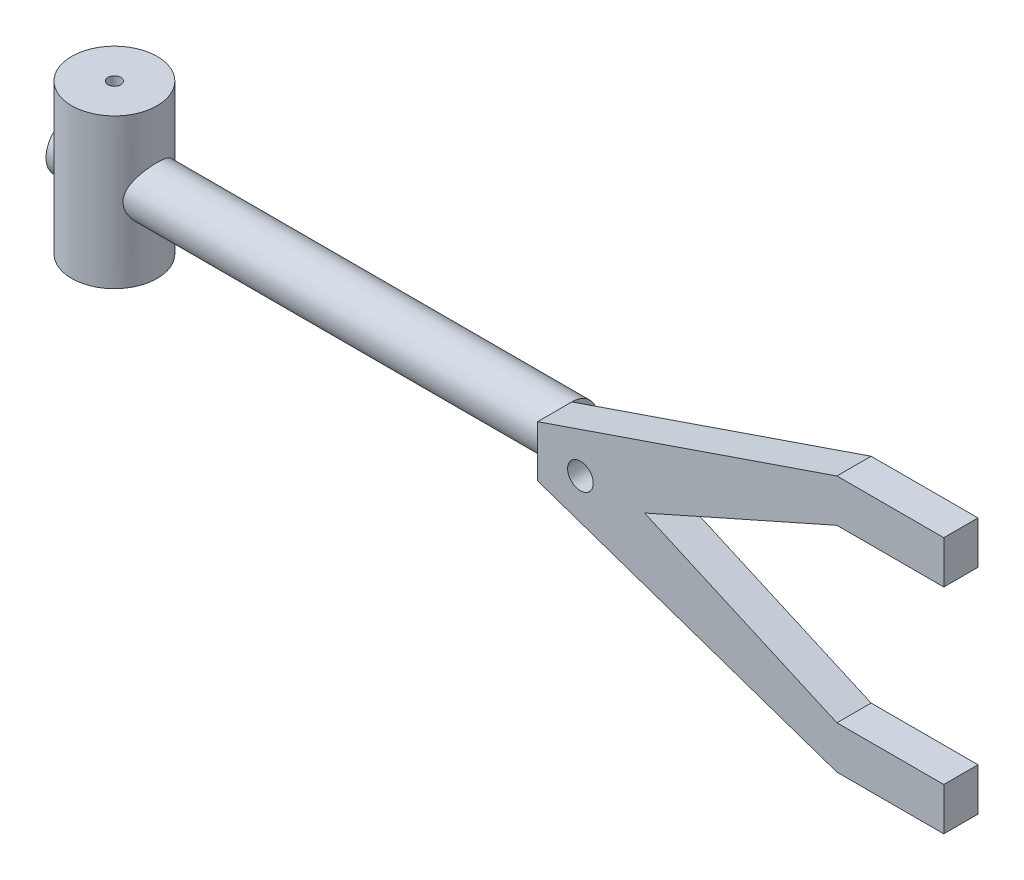
ISO-10303-21;
HEADER;
FILE_DESCRIPTION(('STEP AP214'),'2;1');
FILE_NAME('part.step','',(''),(''),'','','');
FILE_SCHEMA(('AUTOMOTIVE_DESIGN { 1 0 10303 214 1 1 1 1 }'));
ENDSEC;
DATA;
#1=APPLICATION_CONTEXT('core data for automotive mechanical design processes');
#2=APPLICATION_PROTOCOL_DEFINITION('international standard','automotive_design',2000,#1);
#3=PRODUCT_CONTEXT('',#1,'mechanical');
#4=PRODUCT('Part','Part','',(#3));
#5=PRODUCT_RELATED_PRODUCT_CATEGORY('part','',(#4));
#6=PRODUCT_DEFINITION_FORMATION('','',#4);
#7=PRODUCT_DEFINITION_CONTEXT('part definition',#1,'design');
#8=PRODUCT_DEFINITION('design','',#6,#7);
#9=PRODUCT_DEFINITION_SHAPE('','',#8);
#10=(LENGTH_UNIT() NAMED_UNIT(*) SI_UNIT(.MILLI.,.METRE.));
#11=(NAMED_UNIT(*) PLANE_ANGLE_UNIT() SI_UNIT($,.RADIAN.));
#12=(NAMED_UNIT(*) SI_UNIT($,.STERADIAN.) SOLID_ANGLE_UNIT());
#13=UNCERTAINTY_MEASURE_WITH_UNIT(LENGTH_MEASURE(1.E-05),#10,'distance_accuracy_value','');
#14=(GEOMETRIC_REPRESENTATION_CONTEXT(3) GLOBAL_UNCERTAINTY_ASSIGNED_CONTEXT((#13)) GLOBAL_UNIT_ASSIGNED_CONTEXT((#10,
#11,#12)) REPRESENTATION_CONTEXT('',''));
#15=CARTESIAN_POINT('',(0.,0.,0.));
#16=DIRECTION('',(0.,0.,1.));
#17=DIRECTION('',(1.,0.,0.));
#18=AXIS2_PLACEMENT_3D('',#15,#16,#17);
#19=CARTESIAN_POINT('',(-117.,0.,0.));
#20=DIRECTION('',(1.,0.,0.));
#21=DIRECTION('',(0.,1.,0.));
#22=AXIS2_PLACEMENT_3D('',#19,#20,#21);
#23=CYLINDRICAL_SURFACE('',#22,6.);
#24=CARTESIAN_POINT('',(0.,0.,0.));
#25=DIRECTION('',(-1.,0.,0.));
#26=DIRECTION('',(0.,-1.,0.));
#27=AXIS2_PLACEMENT_3D('',#24,#25,#26);
#28=CIRCLE('',#27,6.);
#29=CARTESIAN_POINT('',(0.,-6.,0.));
#30=VERTEX_POINT('',#29);
#31=CARTESIAN_POINT('',(0.,6.,0.));
#32=VERTEX_POINT('',#31);
#33=EDGE_CURVE('E135',#30,#32,#28,.T.);
#34=ORIENTED_EDGE('',*,*,#33,.T.);
#35=EDGE_CURVE('E139',#32,#30,#28,.T.);
#36=ORIENTED_EDGE('',*,*,#35,.T.);
#37=EDGE_LOOP('',(#34,#36));
#38=FACE_BOUND('',#37,.T.);
#39=CARTESIAN_POINT('',(-97.,5.99999999999997,0.));
#40=CARTESIAN_POINT('',(-97.0000011683136,5.99999874519135,-0.153537444551437));
#41=CARTESIAN_POINT('',(-97.0035450390884,5.99409735739944,-0.307113729394928));
#42=CARTESIAN_POINT('',(-97.0176363553633,5.97056698684113,-0.613107521326878));
#43=CARTESIAN_POINT('',(-97.0281878986906,5.95293114218783,-0.76552429760002));
#44=CARTESIAN_POINT('',(-97.0560575008105,5.9061278956508,-1.06824745150987));
#45=CARTESIAN_POINT('',(-97.073388369501,5.87693866177408,-1.21854927251922));
#46=CARTESIAN_POINT('',(-97.1143989472282,5.80740006174153,-1.51572002727397));
#47=CARTESIAN_POINT('',(-97.138081367105,5.76704593017766,-1.66258746605991));
#48=CARTESIAN_POINT('',(-97.1910951803309,5.67591239910302,-1.95109561530948));
#49=CARTESIAN_POINT('',(-97.2203951683515,5.62519085956998,-2.09276039690219));
#50=CARTESIAN_POINT('',(-97.2840807148366,5.51372563088854,-2.37093083799643));
#51=CARTESIAN_POINT('',(-97.3184682376487,5.45297806954219,-2.50743447905545));
#52=CARTESIAN_POINT('',(-97.4281583769666,5.25661592148056,-2.90796291658618));
#53=CARTESIAN_POINT('',(-97.5100583217743,5.10676514066606,-3.1633697760085));
#54=CARTESIAN_POINT('',(-97.6917892990678,4.76089185691862,-3.66523770071096));
#55=CARTESIAN_POINT('',(-97.7925126013811,4.56221486751307,-3.90952112480153));
#56=CARTESIAN_POINT('',(-97.9987981625524,4.13010149782201,-4.36354579042122));
#57=CARTESIAN_POINT('',(-98.1043665015548,3.89662056737338,-4.57324202374219));
#58=CARTESIAN_POINT('',(-98.2655883304351,3.50800100217921,-4.87082578782842));
#59=CARTESIAN_POINT('',(-98.3228427552741,3.36336738175484,-4.97182330842636));
#60=CARTESIAN_POINT('',(-98.4341468221747,3.06480564262361,-5.16122122731059));
#61=CARTESIAN_POINT('',(-98.488195934075,2.91087599479732,-5.24961954505303));
#62=CARTESIAN_POINT('',(-98.5910915626484,2.59462231758671,-5.41290775237596));
#63=CARTESIAN_POINT('',(-98.639944838392,2.43230961233164,-5.48781528185459));
#64=CARTESIAN_POINT('',(-98.7305241067627,2.09994182918051,-5.62338163354011));
#65=CARTESIAN_POINT('',(-98.7722527575794,1.92988966899142,-5.68404577312336));
#66=CARTESIAN_POINT('',(-98.8376238844527,1.62507992086196,-5.77737221892759));
#67=CARTESIAN_POINT('',(-98.8632004570427,1.49171665113409,-5.8132588951073));
#68=CARTESIAN_POINT('',(-98.9083197887664,1.22187048218109,-5.87590039350671));
#69=CARTESIAN_POINT('',(-98.9278638845503,1.08538828124402,-5.90265723881365));
#70=CARTESIAN_POINT('',(-98.9602321012194,0.81025171402131,-5.94666970539668));
#71=CARTESIAN_POINT('',(-98.9730631270236,0.671599731358194,-5.9639350903157));
#72=CARTESIAN_POINT('',(-98.9915617460997,0.392944984699005,-5.9887526638035));
#73=CARTESIAN_POINT('',(-98.9972292160661,0.252942197493465,-5.99630468517717));
#74=CARTESIAN_POINT('',(-99.001184446989,-0.0276304857360648,-6.00157990771218));
#75=CARTESIAN_POINT('',(-98.9994576575907,-0.168200955607132,-5.99928372966397));
#76=CARTESIAN_POINT('',(-98.9886599264627,-0.448547368446017,-5.98485668610316));
#77=CARTESIAN_POINT('',(-98.9795889490494,-0.588323307550082,-5.972725772806));
#78=CARTESIAN_POINT('',(-98.9544403480279,-0.866123194408846,-5.93880584038253));
#79=CARTESIAN_POINT('',(-98.93835956522,-1.00414632330384,-5.91701246647432));
#80=CARTESIAN_POINT('',(-98.8997752813171,-1.277494591076,-5.86407894147696));
#81=CARTESIAN_POINT('',(-98.8772691555594,-1.41281860318444,-5.83293497053063));
#82=CARTESIAN_POINT('',(-98.8018787291031,-1.80996078155561,-5.72698063801509));
#83=CARTESIAN_POINT('',(-98.7407311186157,-2.06687063708726,-5.63915194131273));
#84=CARTESIAN_POINT('',(-98.6029183642115,-2.56281755668071,-5.43180047493027));
#85=CARTESIAN_POINT('',(-98.5262475341567,-2.80184802747996,-5.31226608650175));
#86=CARTESIAN_POINT('',(-98.3497776526446,-3.2999480266043,-5.02070076963738));
#87=CARTESIAN_POINT('',(-98.2482785792978,-3.55521488046637,-4.84314550121071));
#88=CARTESIAN_POINT('',(-98.0941758927166,-3.91476917601741,-4.54957124280611));
#89=CARTESIAN_POINT('',(-98.0424586395197,-4.0308102231317,-4.4470831857426));
#90=CARTESIAN_POINT('',(-97.9394658432492,-4.25478241381091,-4.23329437801548));
#91=CARTESIAN_POINT('',(-97.8881903804441,-4.36271211003625,-4.12199206183185));
#92=CARTESIAN_POINT('',(-97.7801067342962,-4.58443780338888,-3.87481857478411));
#93=CARTESIAN_POINT('',(-97.7235271763483,-4.69694460984084,-3.7376879526544));
#94=CARTESIAN_POINT('',(-97.6138905885834,-4.90992666459092,-3.45314122942452));
#95=CARTESIAN_POINT('',(-97.5608321951904,-5.01040658257615,-3.30572915572594));
#96=CARTESIAN_POINT('',(-97.4596689786642,-5.19848051003326,-3.00130059968158));
#97=CARTESIAN_POINT('',(-97.4115635688938,-5.28607604607442,-2.84428525827771));
#98=CARTESIAN_POINT('',(-97.3216845540227,-5.44741024183805,-2.52155783578279));
#99=CARTESIAN_POINT('',(-97.2799101631641,-5.52115062143015,-2.35584683737313));
#100=CARTESIAN_POINT('',(-97.206357447329,-5.64960422047404,-2.02757278212962));
#101=CARTESIAN_POINT('',(-97.1741153321261,-5.70522314760601,-1.86546851518056));
#102=CARTESIAN_POINT('',(-97.1172304452828,-5.80264595425242,-1.53584722067874));
#103=CARTESIAN_POINT('',(-97.0925874555366,-5.84445023026967,-1.36833034862802));
#104=CARTESIAN_POINT('',(-97.0516718151964,-5.91354449278886,-1.02949369065072));
#105=CARTESIAN_POINT('',(-97.0353908224869,-5.94084894556617,-0.858177873374275));
#106=CARTESIAN_POINT('',(-97.0116833123421,-5.98052893537019,-0.513226306032261));
#107=CARTESIAN_POINT('',(-97.0042555495444,-5.99290657211869,-0.339590885735216));
#108=CARTESIAN_POINT('',(-96.9988818338468,-6.00186382006812,-0.0154285942463958));
#109=CARTESIAN_POINT('',(-96.9997839979444,-6.00036259405744,0.135030316693108));
#110=CARTESIAN_POINT('',(-97.0083472409846,-5.98608043795893,0.435218261170671));
#111=CARTESIAN_POINT('',(-97.0160080972785,-5.97329987944129,0.584947318588602));
#112=CARTESIAN_POINT('',(-97.0379022471421,-5.93663263696758,0.88253605659132));
#113=CARTESIAN_POINT('',(-97.0521350918824,-5.91274671144409,1.03039586412688));
#114=CARTESIAN_POINT('',(-97.086834527003,-5.85417845188862,1.32321247217728));
#115=CARTESIAN_POINT('',(-97.1073012721608,-5.81949584979237,1.46816920051817));
#116=CARTESIAN_POINT('',(-97.153428955466,-5.74072783903301,1.75071908629024));
#117=CARTESIAN_POINT('',(-97.178949657857,-5.69689485862833,1.88840566825774));
#118=CARTESIAN_POINT('',(-97.2349494570828,-5.59980146702507,2.15939029274508));
#119=CARTESIAN_POINT('',(-97.2654301513,-5.54653801822356,2.29268690477591));
#120=CARTESIAN_POINT('',(-97.3634228979728,-5.37333675601086,2.68492536011213));
#121=CARTESIAN_POINT('',(-97.4375207487401,-5.23992952034895,2.93642286384021));
#122=CARTESIAN_POINT('',(-97.6061830068106,-4.92576488033057,3.440061294319));
#123=CARTESIAN_POINT('',(-97.7020732675506,-4.74153073717371,3.68956141515482));
#124=CARTESIAN_POINT('',(-97.9010440169879,-4.33840834205047,4.15611932969621));
#125=CARTESIAN_POINT('',(-98.0041327937384,-4.11947976380931,4.37313879233221));
#126=CARTESIAN_POINT('',(-98.1643281994888,-3.75276518008997,4.68476192706764));
#127=CARTESIAN_POINT('',(-98.221955475257,-3.61538958394491,4.79158950335554));
#128=CARTESIAN_POINT('',(-98.3351255836076,-3.33122262547136,4.99332637800024));
#129=CARTESIAN_POINT('',(-98.3906678747061,-3.18442884363043,5.08823259511329));
#130=CARTESIAN_POINT('',(-98.4978325756379,-2.88215313060631,5.26534568264164));
#131=CARTESIAN_POINT('',(-98.5494575940475,-2.72667710298917,5.34756104251849));
#132=CARTESIAN_POINT('',(-98.6469196114085,-2.40769131587308,5.49855628026276));
#133=CARTESIAN_POINT('',(-98.6927606976014,-2.24418734414733,5.56734566466805));
#134=CARTESIAN_POINT('',(-98.7676877505449,-1.94603699766186,5.67736385859908));
#135=CARTESIAN_POINT('',(-98.7982551666278,-1.81277061398683,5.72133709184489));
#136=CARTESIAN_POINT('',(-98.8537333248931,-1.5424462632691,5.80005690886224));
#137=CARTESIAN_POINT('',(-98.8786470385338,-1.40539033062027,5.83480834103845));
#138=CARTESIAN_POINT('',(-98.9219812013756,-1.12831159570843,5.8946568885387));
#139=CARTESIAN_POINT('',(-98.9404080458909,-0.988291860653551,5.91976351478429));
#140=CARTESIAN_POINT('',(-98.9701278991414,-0.706067478641477,5.9600153732825));
#141=CARTESIAN_POINT('',(-98.9814208662249,-0.563862818932377,5.97516054737435));
#142=CARTESIAN_POINT('',(-98.9964577771601,-0.277786175826586,5.99528753337017));
#143=CARTESIAN_POINT('',(-99.000172772499,-0.133909902441516,6.00023037231476));
#144=CARTESIAN_POINT('',(-98.9998148446397,0.153815740270747,5.99975311757475));
#145=CARTESIAN_POINT('',(-98.9957419077541,0.297665109550212,5.99433300567701));
#146=CARTESIAN_POINT('',(-98.9799711373772,0.584248956658785,5.97321593242882));
#147=CARTESIAN_POINT('',(-98.9682696776365,0.726982871581006,5.9575140835971));
#148=CARTESIAN_POINT('',(-98.9377004379093,1.01019815424108,5.91607855231599));
#149=CARTESIAN_POINT('',(-98.9188326283315,1.15067951267519,5.89034482844307));
#150=CARTESIAN_POINT('',(-98.8756983675041,1.42172585740967,5.83069515235668));
#151=CARTESIAN_POINT('',(-98.8517384847573,1.55244115920583,5.79723709119028));
#152=CARTESIAN_POINT('',(-98.7986864518518,1.81038574141294,5.72193802024644));
#153=CARTESIAN_POINT('',(-98.7695925712961,1.93761382971361,5.68009418342386));
#154=CARTESIAN_POINT('',(-98.6757996936208,2.31322746153951,5.5425635782989));
#155=CARTESIAN_POINT('',(-98.6045661603378,2.55567995347072,5.43484692597259));
#156=CARTESIAN_POINT('',(-98.4394765459815,3.05731273640375,5.17156568978209));
#157=CARTESIAN_POINT('',(-98.3438263014961,3.3133461256292,5.01119401055784));
#158=CARTESIAN_POINT('',(-98.1471851058633,3.79753859537479,4.65500060946757));
#159=CARTESIAN_POINT('',(-98.0461898056341,4.02567446109812,4.45914969547372));
#160=CARTESIAN_POINT('',(-97.8888132718389,4.36183660387998,4.12370341470836));
#161=CARTESIAN_POINT('',(-97.8314199804739,4.48022504267019,3.9947869496437));
#162=CARTESIAN_POINT('',(-97.7191301159279,4.70575349750228,3.72646931290711));
#163=CARTESIAN_POINT('',(-97.6642327829509,4.81289694980725,3.58707136666571));
#164=CARTESIAN_POINT('',(-97.5583381183532,5.0152180045666,3.29828675494298));
#165=CARTESIAN_POINT('',(-97.507343576501,5.11038707829481,3.14889308474009));
#166=CARTESIAN_POINT('',(-97.4106857406357,5.28776685120402,2.84096458145434));
#167=CARTESIAN_POINT('',(-97.3650217792615,5.36997917295573,2.68243089637472));
#168=CARTESIAN_POINT('',(-97.2816168091863,5.5182071558255,2.36211349400593));
#169=CARTESIAN_POINT('',(-97.243677475785,5.58463849522607,2.20057425723904));
#170=CARTESIAN_POINT('',(-97.1751384563891,5.70353095319401,1.87094026552716));
#171=CARTESIAN_POINT('',(-97.1445373624676,5.7559947518102,1.70284677529884));
#172=CARTESIAN_POINT('',(-97.0916908476431,5.84601694335115,1.36200638705992));
#173=CARTESIAN_POINT('',(-97.0694194635051,5.88362167221467,1.18927577776317));
#174=CARTESIAN_POINT('',(-97.0338332792413,5.94348919263529,0.840366716144959));
#175=CARTESIAN_POINT('',(-97.0205110197453,5.9657647618972,0.664191261592117));
#176=CARTESIAN_POINT('',(-97.0079254250642,5.98678337237301,0.406248020354688));
#177=CARTESIAN_POINT('',(-97.0049559446398,5.99173697567714,0.32511286923234));
#178=CARTESIAN_POINT('',(-97.0009928883926,5.9983456790547,0.162655449357514));
#179=CARTESIAN_POINT('',(-96.9999993811109,6.00000066470798,0.0813331742121619));
#180=CARTESIAN_POINT('',(-97.,5.99999999999997,0.));
#181=B_SPLINE_CURVE_WITH_KNOTS('',3,(#39,#40,#41,#42,#43,#44,#45,#46,#47,#48,#49,#50,#51,#52,
#53,#54,#55,#56,#57,#58,#59,#60,#61,#62,#63,#64,#65,#66,#67,#68,#69,#70,#71,#72,#73,#74,#75,#76,
#77,#78,#79,#80,#81,#82,#83,#84,#85,#86,#87,#88,#89,#90,#91,#92,#93,#94,#95,#96,#97,#98,#99,
#100,#101,#102,#103,#104,#105,#106,#107,#108,#109,#110,#111,#112,#113,#114,#115,#116,#117,#118,
#119,#120,#121,#122,#123,#124,#125,#126,#127,#128,#129,#130,#131,#132,#133,#134,#135,#136,#137,
#138,#139,#140,#141,#142,#143,#144,#145,#146,#147,#148,#149,#150,#151,#152,#153,#154,#155,#156,
#157,#158,#159,#160,#161,#162,#163,#164,#165,#166,#167,#168,#169,#170,#171,#172,#173,#174,#175,
#176,#177,#178,#179,#180),.UNSPECIFIED.,.T.,.F.,(4,2,2,2,2,2,2,2,2,2,2,2,2,2,2,2,2,2,2,2,2,2,2,
2,2,2,2,2,2,2,2,2,2,2,2,2,2,2,2,2,2,2,2,2,2,2,2,2,2,2,2,2,2,2,2,2,2,2,2,2,2,2,2,2,2,2,2,2,2,2,
4),(0.,0.460526601189237,0.921322738666799,1.38299381403058,1.84486224490669,2.30422013956031,
2.76375586197537,3.68167311554442,4.66978395284544,5.65917064091952,6.21499415637784,
6.77090935054836,7.3260922945215,7.8810676455441,8.30201487574485,8.72286876721019,
9.1432889221606,9.56371631366182,9.98497139806241,10.4062285292501,10.8276757104407,
11.2492952938387,12.0807558666506,12.9125215553463,13.8897049719634,14.3790534646455,
14.8684890673691,15.4263461011955,15.983985828052,16.5415594312421,17.0990637758595,
17.6214641151699,18.1438494594443,18.6657126431692,19.1875024090024,19.638346895262,
20.0891765301004,20.5399753803935,20.9907854241961,21.4305002375878,21.8703569439357,
22.7494233427058,23.7197001490793,24.6911131196182,25.2405264723239,25.7900815377537,
26.3392673739261,26.8880629256888,27.3185187217206,27.7487477532128,28.1785514321197,
28.6083576204495,29.0398026540948,29.4712484460159,29.9028994771412,30.3345522906548,
30.7452488920627,31.1560841827159,31.9773303104337,32.9246646516038,33.8727820243206,
34.4248169890476,34.9766827677429,35.5289394130232,36.0811268442983,36.6165634055116,
37.1518971546363,37.685548110701,38.2187536985203,38.4626993445494,38.706653452248),.UNSPECIFIED.);
#182=CARTESIAN_POINT('',(-97.,5.99999999999997,0.));
#183=VERTEX_POINT('',#182);
#184=EDGE_CURVE('E11',#183,#183,#181,.T.);
#185=ORIENTED_EDGE('',*,*,#184,.F.);
#186=EDGE_LOOP('',(#185));
#187=FACE_BOUND('',#186,.T.);
#188=ADVANCED_FACE('F35',(#38,#187),#23,.T.);
#189=CARTESIAN_POINT('',(0.,6.,8.));
#190=DIRECTION('',(1.,0.,0.));
#191=DIRECTION('',(0.,1.,0.));
#192=AXIS2_PLACEMENT_3D('',#189,#190,#191);
#193=PLANE('',#192);
#194=ORIENTED_EDGE('',*,*,#33,.F.);
#195=DIRECTION('',(0.,0.,-1.));
#196=VECTOR('',#195,1.);
#197=CARTESIAN_POINT('',(0.,-6.,8.));
#198=LINE('',#197,#196);
#199=CARTESIAN_POINT('',(0.,-6.,8.));
#200=VERTEX_POINT('',#199);
#201=EDGE_CURVE('E269',#200,#30,#198,.T.);
#202=ORIENTED_EDGE('',*,*,#201,.F.);
#203=DIRECTION('',(0.,-1.,0.));
#204=VECTOR('',#203,1.);
#205=CARTESIAN_POINT('',(0.,6.,8.));
#206=LINE('',#205,#204);
#207=CARTESIAN_POINT('',(0.,6.,8.));
#208=VERTEX_POINT('',#207);
#209=EDGE_CURVE('E224',#208,#200,#206,.T.);
#210=ORIENTED_EDGE('',*,*,#209,.F.);
#211=DIRECTION('',(0.,0.,-1.));
#212=VECTOR('',#211,1.);
#213=CARTESIAN_POINT('',(0.,6.,8.));
#214=LINE('',#213,#212);
#215=EDGE_CURVE('E39',#208,#32,#214,.T.);
#216=ORIENTED_EDGE('',*,*,#215,.T.);
#217=EDGE_LOOP('',(#194,#202,#210,#216));
#218=FACE_BOUND('',#217,.T.);
#219=ADVANCED_FACE('F177',(#218),#193,.F.);
#220=CARTESIAN_POINT('',(0.,6.,8.));
#221=DIRECTION('',(0.,0.,-1.));
#222=DIRECTION('',(-1.,0.,0.));
#223=AXIS2_PLACEMENT_3D('',#220,#221,#222);
#224=PLANE('',#223);
#225=DIRECTION('',(-0.945945945945946,-0.324324324324324,0.));
#226=VECTOR('',#225,1.);
#227=CARTESIAN_POINT('',(0.,6.,8.));
#228=LINE('',#227,#226);
#229=CARTESIAN_POINT('',(70.,30.,8.));
#230=VERTEX_POINT('',#229);
#231=EDGE_CURVE('E222',#230,#208,#228,.T.);
#232=ORIENTED_EDGE('',*,*,#231,.T.);
#233=ORIENTED_EDGE('',*,*,#209,.T.);
#234=DIRECTION('',(0.945945945945946,-0.324324324324324,0.));
#235=VECTOR('',#234,1.);
#236=CARTESIAN_POINT('',(70.,-30.,8.));
#237=LINE('',#236,#235);
#238=CARTESIAN_POINT('',(70.,-30.,8.));
#239=VERTEX_POINT('',#238);
#240=EDGE_CURVE('E226',#200,#239,#237,.T.);
#241=ORIENTED_EDGE('',*,*,#240,.T.);
#242=DIRECTION('',(1.,0.,0.));
#243=VECTOR('',#242,1.);
#244=CARTESIAN_POINT('',(95.,-30.,8.));
#245=LINE('',#244,#243);
#246=CARTESIAN_POINT('',(95.,-30.,8.));
#247=VERTEX_POINT('',#246);
#248=EDGE_CURVE('E228',#239,#247,#245,.T.);
#249=ORIENTED_EDGE('',*,*,#248,.T.);
#250=DIRECTION('',(0.,1.,0.));
#251=VECTOR('',#250,1.);
#252=CARTESIAN_POINT('',(95.,-20.,8.));
#253=LINE('',#252,#251);
#254=CARTESIAN_POINT('',(95.,-20.,8.));
#255=VERTEX_POINT('',#254);
#256=EDGE_CURVE('E230',#247,#255,#253,.T.);
#257=ORIENTED_EDGE('',*,*,#256,.T.);
#258=DIRECTION('',(-1.,0.,0.));
#259=VECTOR('',#258,1.);
#260=CARTESIAN_POINT('',(70.,-20.,8.));
#261=LINE('',#260,#259);
#262=CARTESIAN_POINT('',(70.,-20.,8.));
#263=VERTEX_POINT('',#262);
#264=EDGE_CURVE('E232',#255,#263,#261,.T.);
#265=ORIENTED_EDGE('',*,*,#264,.T.);
#266=DIRECTION('',(-0.913811548620257,0.406138466053448,0.));
#267=VECTOR('',#266,1.);
#268=CARTESIAN_POINT('',(25.,0.,8.));
#269=LINE('',#268,#267);
#270=CARTESIAN_POINT('',(25.,0.,8.));
#271=VERTEX_POINT('',#270);
#272=EDGE_CURVE('E234',#263,#271,#269,.T.);
#273=ORIENTED_EDGE('',*,*,#272,.T.);
#274=DIRECTION('',(0.913811548620257,0.406138466053448,0.));
#275=VECTOR('',#274,1.);
#276=CARTESIAN_POINT('',(70.,20.,8.));
#277=LINE('',#276,#275);
#278=CARTESIAN_POINT('',(70.,20.,8.));
#279=VERTEX_POINT('',#278);
#280=EDGE_CURVE('E236',#271,#279,#277,.T.);
#281=ORIENTED_EDGE('',*,*,#280,.T.);
#282=DIRECTION('',(1.,0.,0.));
#283=VECTOR('',#282,1.);
#284=CARTESIAN_POINT('',(95.,20.,8.));
#285=LINE('',#284,#283);
#286=CARTESIAN_POINT('',(95.,20.,8.));
#287=VERTEX_POINT('',#286);
#288=EDGE_CURVE('E238',#279,#287,#285,.T.);
#289=ORIENTED_EDGE('',*,*,#288,.T.);
#290=DIRECTION('',(0.,1.,0.));
#291=VECTOR('',#290,1.);
#292=CARTESIAN_POINT('',(95.,30.,8.));
#293=LINE('',#292,#291);
#294=CARTESIAN_POINT('',(95.,30.,8.));
#295=VERTEX_POINT('',#294);
#296=EDGE_CURVE('E240',#287,#295,#293,.T.);
#297=ORIENTED_EDGE('',*,*,#296,.T.);
#298=DIRECTION('',(-1.,0.,0.));
#299=VECTOR('',#298,1.);
#300=CARTESIAN_POINT('',(70.,30.,8.));
#301=LINE('',#300,#299);
#302=EDGE_CURVE('E58',#295,#230,#301,.T.);
#303=ORIENTED_EDGE('',*,*,#302,.T.);
#304=EDGE_LOOP('',(#232,#233,#241,#249,#257,#265,#273,#281,#289,#297,#303));
#305=FACE_BOUND('',#304,.T.);
#306=CARTESIAN_POINT('',(10.,0.,8.));
#307=DIRECTION('',(0.,0.,1.));
#308=DIRECTION('',(1.,0.,0.));
#309=AXIS2_PLACEMENT_3D('',#306,#307,#308);
#310=CIRCLE('',#309,3.);
#311=CARTESIAN_POINT('',(13.,0.,8.));
#312=VERTEX_POINT('',#311);
#313=EDGE_CURVE('E196',#312,#312,#310,.T.);
#314=ORIENTED_EDGE('',*,*,#313,.F.);
#315=EDGE_LOOP('',(#314));
#316=FACE_BOUND('',#315,.T.);
#317=ADVANCED_FACE('F182',(#305,#316),#224,.F.);
#318=CARTESIAN_POINT('',(0.,6.,0.));
#319=DIRECTION('',(0.,0.,-1.));
#320=DIRECTION('',(-1.,0.,0.));
#321=AXIS2_PLACEMENT_3D('',#318,#319,#320);
#322=PLANE('',#321);
#323=DIRECTION('',(-0.945945945945946,-0.324324324324324,0.));
#324=VECTOR('',#323,1.);
#325=CARTESIAN_POINT('',(0.,6.,0.));
#326=LINE('',#325,#324);
#327=CARTESIAN_POINT('',(70.,30.,0.));
#328=VERTEX_POINT('',#327);
#329=EDGE_CURVE('E199',#328,#32,#326,.T.);
#330=ORIENTED_EDGE('',*,*,#329,.F.);
#331=DIRECTION('',(-1.,0.,0.));
#332=VECTOR('',#331,1.);
#333=CARTESIAN_POINT('',(70.,30.,0.));
#334=LINE('',#333,#332);
#335=CARTESIAN_POINT('',(95.,30.,0.));
#336=VERTEX_POINT('',#335);
#337=EDGE_CURVE('E220',#336,#328,#334,.T.);
#338=ORIENTED_EDGE('',*,*,#337,.F.);
#339=DIRECTION('',(0.,1.,0.));
#340=VECTOR('',#339,1.);
#341=CARTESIAN_POINT('',(95.,30.,0.));
#342=LINE('',#341,#340);
#343=CARTESIAN_POINT('',(95.,20.,0.));
#344=VERTEX_POINT('',#343);
#345=EDGE_CURVE('E218',#344,#336,#342,.T.);
#346=ORIENTED_EDGE('',*,*,#345,.F.);
#347=DIRECTION('',(1.,0.,0.));
#348=VECTOR('',#347,1.);
#349=CARTESIAN_POINT('',(95.,20.,0.));
#350=LINE('',#349,#348);
#351=CARTESIAN_POINT('',(70.,20.,0.));
#352=VERTEX_POINT('',#351);
#353=EDGE_CURVE('E216',#352,#344,#350,.T.);
#354=ORIENTED_EDGE('',*,*,#353,.F.);
#355=DIRECTION('',(0.913811548620257,0.406138466053448,0.));
#356=VECTOR('',#355,1.);
#357=CARTESIAN_POINT('',(70.,20.,0.));
#358=LINE('',#357,#356);
#359=CARTESIAN_POINT('',(25.,0.,0.));
#360=VERTEX_POINT('',#359);
#361=EDGE_CURVE('E214',#360,#352,#358,.T.);
#362=ORIENTED_EDGE('',*,*,#361,.F.);
#363=DIRECTION('',(-0.913811548620257,0.406138466053448,0.));
#364=VECTOR('',#363,1.);
#365=CARTESIAN_POINT('',(25.,0.,0.));
#366=LINE('',#365,#364);
#367=CARTESIAN_POINT('',(70.,-20.,0.));
#368=VERTEX_POINT('',#367);
#369=EDGE_CURVE('E212',#368,#360,#366,.T.);
#370=ORIENTED_EDGE('',*,*,#369,.F.);
#371=DIRECTION('',(-1.,0.,0.));
#372=VECTOR('',#371,1.);
#373=CARTESIAN_POINT('',(70.,-20.,0.));
#374=LINE('',#373,#372);
#375=CARTESIAN_POINT('',(95.,-20.,0.));
#376=VERTEX_POINT('',#375);
#377=EDGE_CURVE('E210',#376,#368,#374,.T.);
#378=ORIENTED_EDGE('',*,*,#377,.F.);
#379=DIRECTION('',(0.,1.,0.));
#380=VECTOR('',#379,1.);
#381=CARTESIAN_POINT('',(95.,-20.,0.));
#382=LINE('',#381,#380);
#383=CARTESIAN_POINT('',(95.,-30.,0.));
#384=VERTEX_POINT('',#383);
#385=EDGE_CURVE('E208',#384,#376,#382,.T.);
#386=ORIENTED_EDGE('',*,*,#385,.F.);
#387=DIRECTION('',(1.,0.,0.));
#388=VECTOR('',#387,1.);
#389=CARTESIAN_POINT('',(95.,-30.,0.));
#390=LINE('',#389,#388);
#391=CARTESIAN_POINT('',(70.,-30.,0.));
#392=VERTEX_POINT('',#391);
#393=EDGE_CURVE('E206',#392,#384,#390,.T.);
#394=ORIENTED_EDGE('',*,*,#393,.F.);
#395=DIRECTION('',(0.945945945945946,-0.324324324324324,0.));
#396=VECTOR('',#395,1.);
#397=CARTESIAN_POINT('',(70.,-30.,0.));
#398=LINE('',#397,#396);
#399=EDGE_CURVE('E204',#30,#392,#398,.T.);
#400=ORIENTED_EDGE('',*,*,#399,.F.);
#401=DIRECTION('',(0.,-1.,0.));
#402=VECTOR('',#401,1.);
#403=CARTESIAN_POINT('',(0.,6.,0.));
#404=LINE('',#403,#402);
#405=EDGE_CURVE('E201',#32,#30,#404,.T.);
#406=ORIENTED_EDGE('',*,*,#405,.F.);
#407=EDGE_LOOP('',(#330,#338,#346,#354,#362,#370,#378,#386,#394,#400,#406));
#408=FACE_BOUND('',#407,.T.);
#409=CARTESIAN_POINT('',(10.,0.,0.));
#410=DIRECTION('',(0.,0.,1.));
#411=DIRECTION('',(1.,0.,0.));
#412=AXIS2_PLACEMENT_3D('',#409,#410,#411);
#413=CIRCLE('',#412,3.);
#414=CARTESIAN_POINT('',(13.,0.,0.));
#415=VERTEX_POINT('',#414);
#416=EDGE_CURVE('E132',#415,#415,#413,.T.);
#417=ORIENTED_EDGE('',*,*,#416,.T.);
#418=EDGE_LOOP('',(#417));
#419=FACE_BOUND('',#418,.T.);
#420=ADVANCED_FACE('F279',(#408,#419),#322,.T.);
#421=CARTESIAN_POINT('',(0.,6.,8.));
#422=DIRECTION('',(0.324324324324324,-0.945945945945946,0.));
#423=DIRECTION('',(0.945945945945946,0.324324324324324,0.));
#424=AXIS2_PLACEMENT_3D('',#421,#422,#423);
#425=PLANE('',#424);
#426=ORIENTED_EDGE('',*,*,#329,.T.);
#427=ORIENTED_EDGE('',*,*,#215,.F.);
#428=ORIENTED_EDGE('',*,*,#231,.F.);
#429=DIRECTION('',(0.,0.,-1.));
#430=VECTOR('',#429,1.);
#431=CARTESIAN_POINT('',(70.,30.,8.));
#432=LINE('',#431,#430);
#433=EDGE_CURVE('E243',#230,#328,#432,.T.);
#434=ORIENTED_EDGE('',*,*,#433,.T.);
#435=EDGE_LOOP('',(#426,#427,#428,#434));
#436=FACE_BOUND('',#435,.T.);
#437=ADVANCED_FACE('F37',(#436),#425,.F.);
#438=CARTESIAN_POINT('',(70.,-30.,8.));
#439=DIRECTION('',(0.324324324324324,0.945945945945946,0.));
#440=DIRECTION('',(-0.945945945945946,0.324324324324324,0.));
#441=AXIS2_PLACEMENT_3D('',#438,#439,#440);
#442=PLANE('',#441);
#443=ORIENTED_EDGE('',*,*,#399,.T.);
#444=DIRECTION('',(0.,0.,-1.));
#445=VECTOR('',#444,1.);
#446=CARTESIAN_POINT('',(70.,-30.,8.));
#447=LINE('',#446,#445);
#448=EDGE_CURVE('E267',#239,#392,#447,.T.);
#449=ORIENTED_EDGE('',*,*,#448,.F.);
#450=ORIENTED_EDGE('',*,*,#240,.F.);
#451=ORIENTED_EDGE('',*,*,#201,.T.);
#452=EDGE_LOOP('',(#443,#449,#450,#451));
#453=FACE_BOUND('',#452,.T.);
#454=ADVANCED_FACE('F285',(#453),#442,.F.);
#455=CARTESIAN_POINT('',(95.,-30.,8.));
#456=DIRECTION('',(0.,1.,0.));
#457=DIRECTION('',(-1.,0.,0.));
#458=AXIS2_PLACEMENT_3D('',#455,#456,#457);
#459=PLANE('',#458);
#460=ORIENTED_EDGE('',*,*,#393,.T.);
#461=DIRECTION('',(0.,0.,-1.));
#462=VECTOR('',#461,1.);
#463=CARTESIAN_POINT('',(95.,-30.,8.));
#464=LINE('',#463,#462);
#465=EDGE_CURVE('E264',#247,#384,#464,.T.);
#466=ORIENTED_EDGE('',*,*,#465,.F.);
#467=ORIENTED_EDGE('',*,*,#248,.F.);
#468=ORIENTED_EDGE('',*,*,#448,.T.);
#469=EDGE_LOOP('',(#460,#466,#467,#468));
#470=FACE_BOUND('',#469,.T.);
#471=ADVANCED_FACE('F288',(#470),#459,.F.);
#472=CARTESIAN_POINT('',(95.,-20.,8.));
#473=DIRECTION('',(-1.,0.,0.));
#474=DIRECTION('',(0.,0.,1.));
#475=AXIS2_PLACEMENT_3D('',#472,#473,#474);
#476=PLANE('',#475);
#477=ORIENTED_EDGE('',*,*,#385,.T.);
#478=DIRECTION('',(0.,0.,-1.));
#479=VECTOR('',#478,1.);
#480=CARTESIAN_POINT('',(95.,-20.,8.));
#481=LINE('',#480,#479);
#482=EDGE_CURVE('E261',#255,#376,#481,.T.);
#483=ORIENTED_EDGE('',*,*,#482,.F.);
#484=ORIENTED_EDGE('',*,*,#256,.F.);
#485=ORIENTED_EDGE('',*,*,#465,.T.);
#486=EDGE_LOOP('',(#477,#483,#484,#485));
#487=FACE_BOUND('',#486,.T.);
#488=ADVANCED_FACE('F321',(#487),#476,.F.);
#489=CARTESIAN_POINT('',(70.,-20.,8.));
#490=DIRECTION('',(0.,-1.,0.));
#491=DIRECTION('',(0.,0.,-1.));
#492=AXIS2_PLACEMENT_3D('',#489,#490,#491);
#493=PLANE('',#492);
#494=ORIENTED_EDGE('',*,*,#377,.T.);
#495=DIRECTION('',(0.,0.,-1.));
#496=VECTOR('',#495,1.);
#497=CARTESIAN_POINT('',(70.,-20.,8.));
#498=LINE('',#497,#496);
#499=EDGE_CURVE('E258',#263,#368,#498,.T.);
#500=ORIENTED_EDGE('',*,*,#499,.F.);
#501=ORIENTED_EDGE('',*,*,#264,.F.);
#502=ORIENTED_EDGE('',*,*,#482,.T.);
#503=EDGE_LOOP('',(#494,#500,#501,#502));
#504=FACE_BOUND('',#503,.T.);
#505=ADVANCED_FACE('F319',(#504),#493,.F.);
#506=CARTESIAN_POINT('',(25.,0.,8.));
#507=DIRECTION('',(-0.406138466053448,-0.913811548620257,0.));
#508=DIRECTION('',(0.913811548620257,-0.406138466053448,0.));
#509=AXIS2_PLACEMENT_3D('',#506,#507,#508);
#510=PLANE('',#509);
#511=ORIENTED_EDGE('',*,*,#369,.T.);
#512=DIRECTION('',(0.,0.,-1.));
#513=VECTOR('',#512,1.);
#514=CARTESIAN_POINT('',(25.,0.,8.));
#515=LINE('',#514,#513);
#516=EDGE_CURVE('E255',#271,#360,#515,.T.);
#517=ORIENTED_EDGE('',*,*,#516,.F.);
#518=ORIENTED_EDGE('',*,*,#272,.F.);
#519=ORIENTED_EDGE('',*,*,#499,.T.);
#520=EDGE_LOOP('',(#511,#517,#518,#519));
#521=FACE_BOUND('',#520,.T.);
#522=ADVANCED_FACE('F314',(#521),#510,.F.);
#523=CARTESIAN_POINT('',(70.,20.,8.));
#524=DIRECTION('',(-0.406138466053448,0.913811548620257,0.));
#525=DIRECTION('',(-0.913811548620257,-0.406138466053448,0.));
#526=AXIS2_PLACEMENT_3D('',#523,#524,#525);
#527=PLANE('',#526);
#528=ORIENTED_EDGE('',*,*,#361,.T.);
#529=DIRECTION('',(0.,0.,-1.));
#530=VECTOR('',#529,1.);
#531=CARTESIAN_POINT('',(70.,20.,8.));
#532=LINE('',#531,#530);
#533=EDGE_CURVE('E252',#279,#352,#532,.T.);
#534=ORIENTED_EDGE('',*,*,#533,.F.);
#535=ORIENTED_EDGE('',*,*,#280,.F.);
#536=ORIENTED_EDGE('',*,*,#516,.T.);
#537=EDGE_LOOP('',(#528,#534,#535,#536));
#538=FACE_BOUND('',#537,.T.);
#539=ADVANCED_FACE('F309',(#538),#527,.F.);
#540=CARTESIAN_POINT('',(95.,20.,8.));
#541=DIRECTION('',(0.,1.,0.));
#542=DIRECTION('',(0.,0.,1.));
#543=AXIS2_PLACEMENT_3D('',#540,#541,#542);
#544=PLANE('',#543);
#545=ORIENTED_EDGE('',*,*,#353,.T.);
#546=DIRECTION('',(0.,0.,-1.));
#547=VECTOR('',#546,1.);
#548=CARTESIAN_POINT('',(95.,20.,8.));
#549=LINE('',#548,#547);
#550=EDGE_CURVE('E249',#287,#344,#549,.T.);
#551=ORIENTED_EDGE('',*,*,#550,.F.);
#552=ORIENTED_EDGE('',*,*,#288,.F.);
#553=ORIENTED_EDGE('',*,*,#533,.T.);
#554=EDGE_LOOP('',(#545,#551,#552,#553));
#555=FACE_BOUND('',#554,.T.);
#556=ADVANCED_FACE('F305',(#555),#544,.F.);
#557=CARTESIAN_POINT('',(95.,30.,8.));
#558=DIRECTION('',(-1.,0.,0.));
#559=DIRECTION('',(0.,0.,1.));
#560=AXIS2_PLACEMENT_3D('',#557,#558,#559);
#561=PLANE('',#560);
#562=ORIENTED_EDGE('',*,*,#345,.T.);
#563=DIRECTION('',(0.,0.,-1.));
#564=VECTOR('',#563,1.);
#565=CARTESIAN_POINT('',(95.,30.,8.));
#566=LINE('',#565,#564);
#567=EDGE_CURVE('E246',#295,#336,#566,.T.);
#568=ORIENTED_EDGE('',*,*,#567,.F.);
#569=ORIENTED_EDGE('',*,*,#296,.F.);
#570=ORIENTED_EDGE('',*,*,#550,.T.);
#571=EDGE_LOOP('',(#562,#568,#569,#570));
#572=FACE_BOUND('',#571,.T.);
#573=ADVANCED_FACE('F300',(#572),#561,.F.);
#574=CARTESIAN_POINT('',(70.,30.,8.));
#575=DIRECTION('',(0.,-1.,0.));
#576=DIRECTION('',(1.,0.,0.));
#577=AXIS2_PLACEMENT_3D('',#574,#575,#576);
#578=PLANE('',#577);
#579=ORIENTED_EDGE('',*,*,#337,.T.);
#580=ORIENTED_EDGE('',*,*,#433,.F.);
#581=ORIENTED_EDGE('',*,*,#302,.F.);
#582=ORIENTED_EDGE('',*,*,#567,.T.);
#583=EDGE_LOOP('',(#579,#580,#581,#582));
#584=FACE_BOUND('',#583,.T.);
#585=ADVANCED_FACE('F294',(#584),#578,.F.);
#586=CARTESIAN_POINT('',(10.,0.,8.));
#587=DIRECTION('',(0.,0.,-1.));
#588=DIRECTION('',(-1.,0.,0.));
#589=AXIS2_PLACEMENT_3D('',#586,#587,#588);
#590=CYLINDRICAL_SURFACE('',#589,3.);
#591=ORIENTED_EDGE('',*,*,#313,.T.);
#592=EDGE_LOOP('',(#591));
#593=FACE_BOUND('',#592,.T.);
#594=ORIENTED_EDGE('',*,*,#416,.F.);
#595=EDGE_LOOP('',(#594));
#596=FACE_BOUND('',#595,.T.);
#597=ADVANCED_FACE('F167',(#593,#596),#590,.F.);
#598=CARTESIAN_POINT('',(0.,0.,0.));
#599=DIRECTION('',(-1.,0.,0.));
#600=DIRECTION('',(0.,-1.,0.));
#601=AXIS2_PLACEMENT_3D('',#598,#599,#600);
#602=PLANE('',#601);
#603=ORIENTED_EDGE('',*,*,#35,.F.);
#604=ORIENTED_EDGE('',*,*,#405,.T.);
#605=EDGE_LOOP('',(#603,#604));
#606=FACE_BOUND('',#605,.T.);
#607=ADVANCED_FACE('F163',(#606),#602,.F.);
#608=CARTESIAN_POINT('',(-107.,17.5,0.));
#609=DIRECTION('',(0.,-1.,0.));
#610=DIRECTION('',(0.,0.,-1.));
#611=AXIS2_PLACEMENT_3D('',#608,#609,#610);
#612=CYLINDRICAL_SURFACE('',#611,9.99999999999999);
#613=CARTESIAN_POINT('',(-117.,5.99999999999997,0.));
#614=CARTESIAN_POINT('',(-116.999998831686,5.99999874519134,0.153537444551436));
#615=CARTESIAN_POINT('',(-116.996454960912,5.99409735739944,0.307113729394928));
#616=CARTESIAN_POINT('',(-116.982363644637,5.97056698684113,0.613107521326878));
#617=CARTESIAN_POINT('',(-116.971812101309,5.95293114218782,0.76552429760002));
#618=CARTESIAN_POINT('',(-116.94394249919,5.90612789565079,1.06824745150987));
#619=CARTESIAN_POINT('',(-116.926611630499,5.87693866177407,1.21854927251922));
#620=CARTESIAN_POINT('',(-116.885601052772,5.80740006174153,1.51572002727397));
#621=CARTESIAN_POINT('',(-116.861918632895,5.76704593017766,1.66258746605991));
#622=CARTESIAN_POINT('',(-116.808904819669,5.67591239910301,1.95109561530948));
#623=CARTESIAN_POINT('',(-116.779604831648,5.62519085956997,2.09276039690219));
#624=CARTESIAN_POINT('',(-116.715919285163,5.51372563088854,2.37093083799643));
#625=CARTESIAN_POINT('',(-116.681531762351,5.45297806954218,2.50743447905545));
#626=CARTESIAN_POINT('',(-116.571841623033,5.25661592148055,2.90796291658618));
#627=CARTESIAN_POINT('',(-116.489941678226,5.10676514066605,3.1633697760085));
#628=CARTESIAN_POINT('',(-116.308210700932,4.76089185691862,3.66523770071096));
#629=CARTESIAN_POINT('',(-116.207487398619,4.56221486751306,3.90952112480153));
#630=CARTESIAN_POINT('',(-116.001201837448,4.13010149782201,4.36354579042122));
#631=CARTESIAN_POINT('',(-115.895633498445,3.89662056737338,4.57324202374219));
#632=CARTESIAN_POINT('',(-115.734411669565,3.50800100217921,4.87082578782842));
#633=CARTESIAN_POINT('',(-115.677157244726,3.36336738175484,4.97182330842635));
#634=CARTESIAN_POINT('',(-115.565853177825,3.06480564262361,5.16122122731059));
#635=CARTESIAN_POINT('',(-115.511804065925,2.91087599479732,5.24961954505303));
#636=CARTESIAN_POINT('',(-115.408908437352,2.59462231758671,5.41290775237596));
#637=CARTESIAN_POINT('',(-115.360055161608,2.43230961233164,5.48781528185459));
#638=CARTESIAN_POINT('',(-115.269475893237,2.09994182918051,5.62338163354011));
#639=CARTESIAN_POINT('',(-115.227747242421,1.92988966899142,5.68404577312335));
#640=CARTESIAN_POINT('',(-115.162376115547,1.62507992086196,5.77737221892759));
#641=CARTESIAN_POINT('',(-115.136799542957,1.49171665113408,5.8132588951073));
#642=CARTESIAN_POINT('',(-115.091680211234,1.22187048218109,5.87590039350671));
#643=CARTESIAN_POINT('',(-115.07213611545,1.08538828124401,5.90265723881365));
#644=CARTESIAN_POINT('',(-115.039767898781,0.810251714021307,5.94666970539668));
#645=CARTESIAN_POINT('',(-115.026936872976,0.671599731358192,5.9639350903157));
#646=CARTESIAN_POINT('',(-115.0084382539,0.392944984699002,5.9887526638035));
#647=CARTESIAN_POINT('',(-115.002770783934,0.252942197493463,5.99630468517717));
#648=CARTESIAN_POINT('',(-114.998815553011,-0.027630485736066,6.00157990771218));
#649=CARTESIAN_POINT('',(-115.000542342409,-0.168200955607132,5.99928372966397));
#650=CARTESIAN_POINT('',(-115.011340073537,-0.448547368446016,5.98485668610316));
#651=CARTESIAN_POINT('',(-115.020411050951,-0.58832330755008,5.97272577280601));
#652=CARTESIAN_POINT('',(-115.045559651972,-0.866123194408846,5.93880584038253));
#653=CARTESIAN_POINT('',(-115.06164043478,-1.00414632330384,5.91701246647433));
#654=CARTESIAN_POINT('',(-115.100224718683,-1.277494591076,5.86407894147696));
#655=CARTESIAN_POINT('',(-115.122730844441,-1.41281860318444,5.83293497053063));
#656=CARTESIAN_POINT('',(-115.198121270897,-1.80996078155561,5.72698063801509));
#657=CARTESIAN_POINT('',(-115.259268881384,-2.06687063708725,5.63915194131273));
#658=CARTESIAN_POINT('',(-115.397081635789,-2.5628175566807,5.43180047493027));
#659=CARTESIAN_POINT('',(-115.473752465843,-2.80184802747996,5.31226608650175));
#660=CARTESIAN_POINT('',(-115.650222347355,-3.2999480266043,5.02070076963738));
#661=CARTESIAN_POINT('',(-115.751721420702,-3.55521488046637,4.84314550121071));
#662=CARTESIAN_POINT('',(-115.905824107283,-3.91476917601741,4.54957124280611));
#663=CARTESIAN_POINT('',(-115.95754136048,-4.0308102231317,4.4470831857426));
#664=CARTESIAN_POINT('',(-116.060534156751,-4.25478241381092,4.23329437801548));
#665=CARTESIAN_POINT('',(-116.111809619556,-4.36271211003625,4.12199206183186));
#666=CARTESIAN_POINT('',(-116.219893265704,-4.58443780338889,3.87481857478411));
#667=CARTESIAN_POINT('',(-116.276472823652,-4.69694460984084,3.7376879526544));
#668=CARTESIAN_POINT('',(-116.386109411417,-4.90992666459092,3.45314122942452));
#669=CARTESIAN_POINT('',(-116.43916780481,-5.01040658257616,3.30572915572594));
#670=CARTESIAN_POINT('',(-116.540331021336,-5.19848051003327,3.00130059968158));
#671=CARTESIAN_POINT('',(-116.588436431106,-5.28607604607443,2.84428525827771));
#672=CARTESIAN_POINT('',(-116.678315445977,-5.44741024183806,2.52155783578279));
#673=CARTESIAN_POINT('',(-116.720089836836,-5.52115062143015,2.35584683737313));
#674=CARTESIAN_POINT('',(-116.793642552671,-5.64960422047405,2.02757278212963));
#675=CARTESIAN_POINT('',(-116.825884667874,-5.70522314760602,1.86546851518056));
#676=CARTESIAN_POINT('',(-116.882769554717,-5.80264595425243,1.53584722067874));
#677=CARTESIAN_POINT('',(-116.907412544463,-5.84445023026967,1.36833034862802));
#678=CARTESIAN_POINT('',(-116.948328184804,-5.91354449278886,1.02949369065073));
#679=CARTESIAN_POINT('',(-116.964609177513,-5.94084894556618,0.858177873374282));
#680=CARTESIAN_POINT('',(-116.988316687658,-5.98052893537019,0.513226306032269));
#681=CARTESIAN_POINT('',(-116.995744450456,-5.99290657211869,0.339590885735224));
#682=CARTESIAN_POINT('',(-117.001118166153,-6.00186382006813,0.0154285942464043));
#683=CARTESIAN_POINT('',(-117.000216002056,-6.00036259405744,-0.1350303166931));
#684=CARTESIAN_POINT('',(-116.991652759015,-5.98608043795894,-0.435218261170663));
#685=CARTESIAN_POINT('',(-116.983991902722,-5.9732998794413,-0.584947318588594));
#686=CARTESIAN_POINT('',(-116.962097752858,-5.93663263696758,-0.882536056591312));
#687=CARTESIAN_POINT('',(-116.947864908118,-5.9127467114441,-1.03039586412687));
#688=CARTESIAN_POINT('',(-116.913165472997,-5.85417845188863,-1.32321247217727));
#689=CARTESIAN_POINT('',(-116.892698727839,-5.81949584979238,-1.46816920051816));
#690=CARTESIAN_POINT('',(-116.846571044534,-5.74072783903301,-1.75071908629023));
#691=CARTESIAN_POINT('',(-116.821050342143,-5.69689485862834,-1.88840566825773));
#692=CARTESIAN_POINT('',(-116.765050542917,-5.59980146702508,-2.15939029274508));
#693=CARTESIAN_POINT('',(-116.7345698487,-5.54653801822356,-2.29268690477591));
#694=CARTESIAN_POINT('',(-116.636577102027,-5.37333675601087,-2.68492536011212));
#695=CARTESIAN_POINT('',(-116.56247925126,-5.23992952034896,-2.9364228638402));
#696=CARTESIAN_POINT('',(-116.393816993189,-4.92576488033057,-3.440061294319));
#697=CARTESIAN_POINT('',(-116.297926732449,-4.74153073717372,-3.68956141515482));
#698=CARTESIAN_POINT('',(-116.098955983012,-4.33840834205048,-4.15611932969621));
#699=CARTESIAN_POINT('',(-115.995867206262,-4.11947976380932,-4.37313879233221));
#700=CARTESIAN_POINT('',(-115.835671800511,-3.75276518008998,-4.68476192706763));
#701=CARTESIAN_POINT('',(-115.778044524743,-3.61538958394492,-4.79158950335553));
#702=CARTESIAN_POINT('',(-115.664874416392,-3.33122262547137,-4.99332637800023));
#703=CARTESIAN_POINT('',(-115.609332125294,-3.18442884363044,-5.08823259511329));
#704=CARTESIAN_POINT('',(-115.502167424362,-2.88215313060632,-5.26534568264164));
#705=CARTESIAN_POINT('',(-115.450542405953,-2.72667710298918,-5.34756104251849));
#706=CARTESIAN_POINT('',(-115.353080388591,-2.40769131587309,-5.49855628026276));
#707=CARTESIAN_POINT('',(-115.307239302399,-2.24418734414734,-5.56734566466805));
#708=CARTESIAN_POINT('',(-115.232312249455,-1.94603699766187,-5.67736385859908));
#709=CARTESIAN_POINT('',(-115.201744833372,-1.81277061398684,-5.72133709184488));
#710=CARTESIAN_POINT('',(-115.146266675107,-1.54244626326911,-5.80005690886224));
#711=CARTESIAN_POINT('',(-115.121352961466,-1.40539033062028,-5.83480834103845));
#712=CARTESIAN_POINT('',(-115.078018798624,-1.12831159570844,-5.8946568885387));
#713=CARTESIAN_POINT('',(-115.059591954109,-0.988291860653561,-5.91976351478428));
#714=CARTESIAN_POINT('',(-115.029872100859,-0.706067478641487,-5.9600153732825));
#715=CARTESIAN_POINT('',(-115.018579133775,-0.563862818932387,-5.97516054737435));
#716=CARTESIAN_POINT('',(-115.00354222284,-0.277786175826596,-5.99528753337017));
#717=CARTESIAN_POINT('',(-114.999827227501,-0.133909902441526,-6.00023037231476));
#718=CARTESIAN_POINT('',(-115.00018515536,0.153815740270738,-5.99975311757475));
#719=CARTESIAN_POINT('',(-115.004258092246,0.297665109550202,-5.99433300567701));
#720=CARTESIAN_POINT('',(-115.020028862623,0.584248956658776,-5.97321593242882));
#721=CARTESIAN_POINT('',(-115.031730322364,0.726982871580998,-5.9575140835971));
#722=CARTESIAN_POINT('',(-115.062299562091,1.01019815424107,-5.91607855231599));
#723=CARTESIAN_POINT('',(-115.081167371668,1.15067951267519,-5.89034482844307));
#724=CARTESIAN_POINT('',(-115.124301632496,1.42172585740966,-5.83069515235668));
#725=CARTESIAN_POINT('',(-115.148261515243,1.55244115920582,-5.79723709119028));
#726=CARTESIAN_POINT('',(-115.201313548148,1.81038574141294,-5.72193802024644));
#727=CARTESIAN_POINT('',(-115.230407428704,1.9376138297136,-5.68009418342386));
#728=CARTESIAN_POINT('',(-115.324200306379,2.3132274615395,-5.5425635782989));
#729=CARTESIAN_POINT('',(-115.395433839662,2.55567995347071,-5.43484692597259));
#730=CARTESIAN_POINT('',(-115.560523454019,3.05731273640375,-5.17156568978209));
#731=CARTESIAN_POINT('',(-115.656173698504,3.31334612562919,-5.01119401055784));
#732=CARTESIAN_POINT('',(-115.852814894137,3.79753859537479,-4.65500060946757));
#733=CARTESIAN_POINT('',(-115.953810194366,4.02567446109811,-4.45914969547372));
#734=CARTESIAN_POINT('',(-116.111186728161,4.36183660387996,-4.12370341470836));
#735=CARTESIAN_POINT('',(-116.168580019526,4.48022504267018,-3.9947869496437));
#736=CARTESIAN_POINT('',(-116.280869884072,4.70575349750227,-3.72646931290711));
#737=CARTESIAN_POINT('',(-116.335767217049,4.81289694980724,-3.58707136666572));
#738=CARTESIAN_POINT('',(-116.441661881647,5.01521800456659,-3.29828675494299));
#739=CARTESIAN_POINT('',(-116.492656423499,5.1103870782948,-3.1488930847401));
#740=CARTESIAN_POINT('',(-116.589314259364,5.28776685120401,-2.84096458145435));
#741=CARTESIAN_POINT('',(-116.634978220739,5.36997917295572,-2.68243089637473));
#742=CARTESIAN_POINT('',(-116.718383190814,5.5182071558255,-2.36211349400594));
#743=CARTESIAN_POINT('',(-116.756322524215,5.58463849522606,-2.20057425723905));
#744=CARTESIAN_POINT('',(-116.824861543611,5.703530953194,-1.87094026552717));
#745=CARTESIAN_POINT('',(-116.855462637532,5.75599475181019,-1.70284677529885));
#746=CARTESIAN_POINT('',(-116.908309152357,5.84601694335114,-1.36200638705993));
#747=CARTESIAN_POINT('',(-116.930580536495,5.88362167221466,-1.18927577776318));
#748=CARTESIAN_POINT('',(-116.966166720759,5.94348919263528,-0.840366716144964));
#749=CARTESIAN_POINT('',(-116.979488980255,5.96576476189719,-0.664191261592124));
#750=CARTESIAN_POINT('',(-116.992074574936,5.986783372373,-0.406248020354693));
#751=CARTESIAN_POINT('',(-116.99504405536,5.99173697567713,-0.325112869232343));
#752=CARTESIAN_POINT('',(-116.999007111607,5.99834567905469,-0.162655449357514));
#753=CARTESIAN_POINT('',(-117.000000618889,6.00000066470797,-0.081333174212162));
#754=CARTESIAN_POINT('',(-117.,5.99999999999997,0.));
#755=B_SPLINE_CURVE_WITH_KNOTS('',3,(#613,#614,#615,#616,#617,#618,#619,#620,#621,#622,#623,
#624,#625,#626,#627,#628,#629,#630,#631,#632,#633,#634,#635,#636,#637,#638,#639,#640,#641,#642,
#643,#644,#645,#646,#647,#648,#649,#650,#651,#652,#653,#654,#655,#656,#657,#658,#659,#660,#661,
#662,#663,#664,#665,#666,#667,#668,#669,#670,#671,#672,#673,#674,#675,#676,#677,#678,#679,#680,
#681,#682,#683,#684,#685,#686,#687,#688,#689,#690,#691,#692,#693,#694,#695,#696,#697,#698,#699,
#700,#701,#702,#703,#704,#705,#706,#707,#708,#709,#710,#711,#712,#713,#714,#715,#716,#717,#718,
#719,#720,#721,#722,#723,#724,#725,#726,#727,#728,#729,#730,#731,#732,#733,#734,#735,#736,#737,
#738,#739,#740,#741,#742,#743,#744,#745,#746,#747,#748,#749,#750,#751,#752,#753,#754),
.UNSPECIFIED.,.T.,.F.,(4,2,2,2,2,2,2,2,2,2,2,2,2,2,2,2,2,2,2,2,2,2,2,2,2,2,2,2,2,2,2,2,2,2,2,2,
2,2,2,2,2,2,2,2,2,2,2,2,2,2,2,2,2,2,2,2,2,2,2,2,2,2,2,2,2,2,2,2,2,2,4),(0.,0.460526601189236,
0.921322738666798,1.38299381403057,1.84486224490669,2.30422013956031,2.76375586197537,
3.68167311554442,4.66978395284544,5.65917064091952,6.21499415637783,6.77090935054835,
7.32609229452149,7.88106764554409,8.30201487574484,8.72286876721018,9.1432889221606,
9.56371631366181,9.9849713980624,10.40622852925,10.8276757104407,11.2492952938387,
12.0807558666506,12.9125215553463,13.8897049719634,14.3790534646455,14.8684890673691,
15.4263461011955,15.983985828052,16.5415594312421,17.0990637758595,17.6214641151699,
18.1438494594443,18.6657126431692,19.1875024090024,19.638346895262,20.0891765301004,
20.5399753803935,20.9907854241961,21.4305002375878,21.8703569439357,22.7494233427058,
23.7197001490793,24.6911131196182,25.2405264723239,25.7900815377537,26.3392673739261,
26.8880629256888,27.3185187217206,27.7487477532128,28.1785514321197,28.6083576204495,
29.0398026540948,29.4712484460159,29.9028994771413,30.3345522906548,30.7452488920627,
31.156084182716,31.9773303104337,32.9246646516038,33.8727820243206,34.4248169890476,
34.9766827677429,35.5289394130232,36.0811268442983,36.6165634055116,37.1518971546363,
37.685548110701,38.2187536985203,38.4626993445494,38.706653452248),.UNSPECIFIED.);
#756=CARTESIAN_POINT('',(-117.,-6.00000000000004,0.));
#757=VERTEX_POINT('',#756);
#758=CARTESIAN_POINT('',(-117.,5.99999999999997,0.));
#759=VERTEX_POINT('',#758);
#760=EDGE_CURVE('E50',#757,#759,#755,.T.);
#761=ORIENTED_EDGE('',*,*,#760,.T.);
#762=EDGE_CURVE('E136',#759,#757,#755,.T.);
#763=ORIENTED_EDGE('',*,*,#762,.T.);
#764=EDGE_LOOP('',(#761,#763));
#765=FACE_BOUND('',#764,.T.);
#766=CARTESIAN_POINT('',(-107.,-17.5,0.));
#767=DIRECTION('',(0.,1.,0.));
#768=DIRECTION('',(0.,0.,1.));
#769=AXIS2_PLACEMENT_3D('',#766,#767,#768);
#770=CIRCLE('',#769,9.99999999999999);
#771=CARTESIAN_POINT('',(-107.,-17.5,9.99999999999999));
#772=VERTEX_POINT('',#771);
#773=EDGE_CURVE('E145',#772,#772,#770,.T.);
#774=ORIENTED_EDGE('',*,*,#773,.T.);
#775=EDGE_LOOP('',(#774));
#776=FACE_BOUND('',#775,.T.);
#777=CARTESIAN_POINT('',(-107.,17.5,0.));
#778=DIRECTION('',(0.,1.,0.));
#779=DIRECTION('',(0.,0.,1.));
#780=AXIS2_PLACEMENT_3D('',#777,#778,#779);
#781=CIRCLE('',#780,9.99999999999999);
#782=CARTESIAN_POINT('',(-107.,17.5,9.99999999999999));
#783=VERTEX_POINT('',#782);
#784=EDGE_CURVE('E143',#783,#783,#781,.T.);
#785=ORIENTED_EDGE('',*,*,#784,.F.);
#786=EDGE_LOOP('',(#785));
#787=FACE_BOUND('',#786,.T.);
#788=ORIENTED_EDGE('',*,*,#184,.T.);
#789=EDGE_LOOP('',(#788));
#790=FACE_BOUND('',#789,.T.);
#791=ADVANCED_FACE('F141',(#765,#776,#787,#790),#612,.T.);
#792=CARTESIAN_POINT('',(-107.,17.5,0.));
#793=DIRECTION('',(0.,1.,0.));
#794=DIRECTION('',(0.,0.,1.));
#795=AXIS2_PLACEMENT_3D('',#792,#793,#794);
#796=PLANE('',#795);
#797=CARTESIAN_POINT('',(-107.,17.5,0.));
#798=DIRECTION('',(0.,1.,0.));
#799=DIRECTION('',(0.,0.,1.));
#800=AXIS2_PLACEMENT_3D('',#797,#798,#799);
#801=CIRCLE('',#800,1.5);
#802=CARTESIAN_POINT('',(-107.,17.5,1.5));
#803=VERTEX_POINT('',#802);
#804=EDGE_CURVE('E441',#803,#803,#801,.T.);
#805=ORIENTED_EDGE('',*,*,#804,.F.);
#806=EDGE_LOOP('',(#805));
#807=FACE_BOUND('',#806,.T.);
#808=ORIENTED_EDGE('',*,*,#784,.T.);
#809=EDGE_LOOP('',(#808));
#810=FACE_BOUND('',#809,.T.);
#811=ADVANCED_FACE('F162',(#807,#810),#796,.T.);
#812=CARTESIAN_POINT('',(-107.,-17.5,0.));
#813=DIRECTION('',(0.,1.,0.));
#814=DIRECTION('',(0.,0.,1.));
#815=AXIS2_PLACEMENT_3D('',#812,#813,#814);
#816=PLANE('',#815);
#817=CARTESIAN_POINT('',(-107.,-17.5,0.));
#818=DIRECTION('',(0.,1.,0.));
#819=DIRECTION('',(0.,0.,1.));
#820=AXIS2_PLACEMENT_3D('',#817,#818,#819);
#821=CIRCLE('',#820,1.5);
#822=CARTESIAN_POINT('',(-107.,-17.5,1.5));
#823=VERTEX_POINT('',#822);
#824=EDGE_CURVE('E438',#823,#823,#821,.T.);
#825=ORIENTED_EDGE('',*,*,#824,.T.);
#826=EDGE_LOOP('',(#825));
#827=FACE_BOUND('',#826,.T.);
#828=ORIENTED_EDGE('',*,*,#773,.F.);
#829=EDGE_LOOP('',(#828));
#830=FACE_BOUND('',#829,.T.);
#831=ADVANCED_FACE('F175',(#827,#830),#816,.F.);
#832=ORIENTED_EDGE('',*,*,#760,.F.);
#833=CARTESIAN_POINT('',(-117.,0.,0.));
#834=DIRECTION('',(-1.,0.,0.));
#835=DIRECTION('',(0.,-1.,0.));
#836=AXIS2_PLACEMENT_3D('',#833,#834,#835);
#837=CIRCLE('',#836,6.);
#838=EDGE_CURVE('E128',#759,#757,#837,.T.);
#839=ORIENTED_EDGE('',*,*,#838,.F.);
#840=EDGE_LOOP('',(#832,#839));
#841=FACE_BOUND('',#840,.T.);
#842=ADVANCED_FACE('F134',(#841),#23,.T.);
#843=CARTESIAN_POINT('',(-117.,0.,0.));
#844=DIRECTION('',(-1.,0.,0.));
#845=DIRECTION('',(0.,-1.,0.));
#846=AXIS2_PLACEMENT_3D('',#843,#844,#845);
#847=PLANE('',#846);
#848=EDGE_CURVE('E126',#757,#759,#837,.T.);
#849=ORIENTED_EDGE('',*,*,#848,.T.);
#850=ORIENTED_EDGE('',*,*,#838,.T.);
#851=EDGE_LOOP('',(#849,#850));
#852=FACE_BOUND('',#851,.T.);
#853=ADVANCED_FACE('F127',(#852),#847,.T.);
#854=ORIENTED_EDGE('',*,*,#762,.F.);
#855=ORIENTED_EDGE('',*,*,#848,.F.);
#856=EDGE_LOOP('',(#854,#855));
#857=FACE_BOUND('',#856,.T.);
#858=ADVANCED_FACE('F137',(#857),#23,.T.);
#859=CARTESIAN_POINT('',(-107.,-17.5,0.));
#860=DIRECTION('',(0.,1.,0.));
#861=DIRECTION('',(0.,0.,1.));
#862=AXIS2_PLACEMENT_3D('',#859,#860,#861);
#863=CYLINDRICAL_SURFACE('',#862,1.5);
#864=ORIENTED_EDGE('',*,*,#824,.F.);
#865=EDGE_LOOP('',(#864));
#866=FACE_BOUND('',#865,.T.);
#867=ORIENTED_EDGE('',*,*,#804,.T.);
#868=EDGE_LOOP('',(#867));
#869=FACE_BOUND('',#868,.T.);
#870=ADVANCED_FACE('F174',(#866,#869),#863,.F.);
#871=CLOSED_SHELL('',(#188,#219,#317,#420,#437,#454,#471,#488,#505,#522,#539,#556,#573,#585,
#597,#607,#791,#811,#831,#842,#853,#858,#870));
#872=MANIFOLD_SOLID_BREP('B2',#871);
#873=ADVANCED_BREP_SHAPE_REPRESENTATION('',(#18,#872),#14);
#874=SHAPE_DEFINITION_REPRESENTATION(#9,#873);
ENDSEC;
END-ISO-10303-21;
